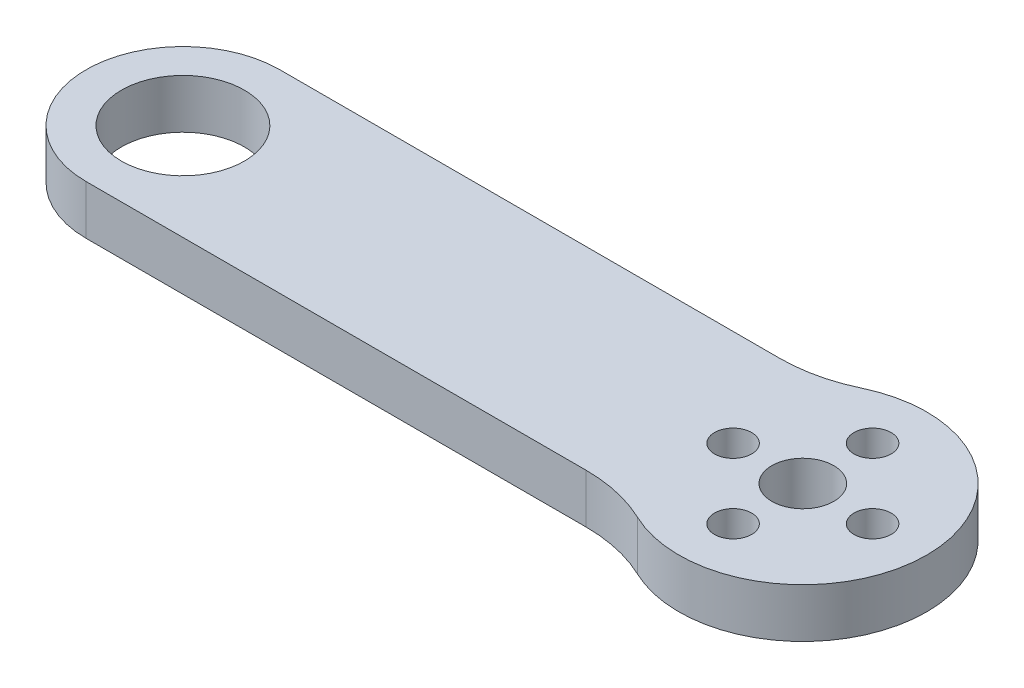
ISO-10303-21;
HEADER;
FILE_DESCRIPTION(('STEP AP214'),'2;1');
FILE_NAME('part.step','',(''),(''),'','','');
FILE_SCHEMA(('AUTOMOTIVE_DESIGN { 1 0 10303 214 1 1 1 1 }'));
ENDSEC;
DATA;
#1=APPLICATION_CONTEXT('core data for automotive mechanical design processes');
#2=APPLICATION_PROTOCOL_DEFINITION('international standard','automotive_design',2000,#1);
#3=PRODUCT_CONTEXT('',#1,'mechanical');
#4=PRODUCT('Part','Part','',(#3));
#5=PRODUCT_RELATED_PRODUCT_CATEGORY('part','',(#4));
#6=PRODUCT_DEFINITION_FORMATION('','',#4);
#7=PRODUCT_DEFINITION_CONTEXT('part definition',#1,'design');
#8=PRODUCT_DEFINITION('design','',#6,#7);
#9=PRODUCT_DEFINITION_SHAPE('','',#8);
#10=(LENGTH_UNIT() NAMED_UNIT(*) SI_UNIT(.MILLI.,.METRE.));
#11=(NAMED_UNIT(*) PLANE_ANGLE_UNIT() SI_UNIT($,.RADIAN.));
#12=(NAMED_UNIT(*) SI_UNIT($,.STERADIAN.) SOLID_ANGLE_UNIT());
#13=UNCERTAINTY_MEASURE_WITH_UNIT(LENGTH_MEASURE(1.E-05),#10,'distance_accuracy_value','');
#14=(GEOMETRIC_REPRESENTATION_CONTEXT(3) GLOBAL_UNCERTAINTY_ASSIGNED_CONTEXT((#13)) GLOBAL_UNIT_ASSIGNED_CONTEXT((#10,
#11,#12)) REPRESENTATION_CONTEXT('',''));
#15=CARTESIAN_POINT('',(0.,0.,0.));
#16=DIRECTION('',(0.,0.,1.));
#17=DIRECTION('',(1.,0.,0.));
#18=AXIS2_PLACEMENT_3D('',#15,#16,#17);
#19=CARTESIAN_POINT('',(-7.74193128360102,3.175,16.25));
#20=DIRECTION('',(0.,-1.,0.));
#21=DIRECTION('',(0.,0.,-1.));
#22=AXIS2_PLACEMENT_3D('',#19,#20,#21);
#23=PLANE('',#22);
#24=CARTESIAN_POINT('',(0.,3.175,-4.5));
#25=DIRECTION('',(0.,1.,0.));
#26=DIRECTION('',(0.,0.,1.));
#27=AXIS2_PLACEMENT_3D('',#24,#25,#26);
#28=CIRCLE('',#27,1.2);
#29=CARTESIAN_POINT('',(0.,3.175,-3.3));
#30=VERTEX_POINT('',#29);
#31=EDGE_CURVE('E192',#30,#30,#28,.T.);
#32=ORIENTED_EDGE('',*,*,#31,.F.);
#33=EDGE_LOOP('',(#32));
#34=FACE_BOUND('',#33,.T.);
#35=CARTESIAN_POINT('',(4.5,3.175,0.));
#36=DIRECTION('',(0.,1.,0.));
#37=DIRECTION('',(0.,0.,1.));
#38=AXIS2_PLACEMENT_3D('',#35,#36,#37);
#39=CIRCLE('',#38,1.2);
#40=CARTESIAN_POINT('',(4.5,3.175,1.2));
#41=VERTEX_POINT('',#40);
#42=EDGE_CURVE('E194',#41,#41,#39,.T.);
#43=ORIENTED_EDGE('',*,*,#42,.F.);
#44=EDGE_LOOP('',(#43));
#45=FACE_BOUND('',#44,.T.);
#46=CARTESIAN_POINT('',(0.,3.175,4.5));
#47=DIRECTION('',(0.,1.,0.));
#48=DIRECTION('',(0.,0.,1.));
#49=AXIS2_PLACEMENT_3D('',#46,#47,#48);
#50=CIRCLE('',#49,1.2);
#51=CARTESIAN_POINT('',(0.,3.175,5.7));
#52=VERTEX_POINT('',#51);
#53=EDGE_CURVE('E202',#52,#52,#50,.T.);
#54=ORIENTED_EDGE('',*,*,#53,.F.);
#55=EDGE_LOOP('',(#54));
#56=FACE_BOUND('',#55,.T.);
#57=CARTESIAN_POINT('',(-4.5,3.175,0.));
#58=DIRECTION('',(0.,1.,0.));
#59=DIRECTION('',(0.,0.,1.));
#60=AXIS2_PLACEMENT_3D('',#57,#58,#59);
#61=CIRCLE('',#60,1.2);
#62=CARTESIAN_POINT('',(-4.5,3.175,1.2));
#63=VERTEX_POINT('',#62);
#64=EDGE_CURVE('E208',#63,#63,#61,.T.);
#65=ORIENTED_EDGE('',*,*,#64,.F.);
#66=EDGE_LOOP('',(#65));
#67=FACE_BOUND('',#66,.T.);
#68=CARTESIAN_POINT('',(-7.74193128360102,3.175,16.25));
#69=DIRECTION('',(0.,-1.,0.));
#70=DIRECTION('',(0.,0.,-1.));
#71=AXIS2_PLACEMENT_3D('',#68,#69,#70);
#72=CIRCLE('',#71,10.);
#73=CARTESIAN_POINT('',(-7.74193128360102,3.175,6.25));
#74=VERTEX_POINT('',#73);
#75=CARTESIAN_POINT('',(-3.44085834826712,3.175,7.22222222222222));
#76=VERTEX_POINT('',#75);
#77=EDGE_CURVE('E130',#74,#76,#72,.T.);
#78=ORIENTED_EDGE('',*,*,#77,.T.);
#79=CARTESIAN_POINT('',(0.,3.175,0.));
#80=DIRECTION('',(0.,1.,0.));
#81=DIRECTION('',(0.,0.,1.));
#82=AXIS2_PLACEMENT_3D('',#79,#80,#81);
#83=CIRCLE('',#82,8.);
#84=CARTESIAN_POINT('',(-3.44085834826712,3.175,-7.22222222222222));
#85=VERTEX_POINT('',#84);
#86=EDGE_CURVE('E88',#76,#85,#83,.T.);
#87=ORIENTED_EDGE('',*,*,#86,.T.);
#88=CARTESIAN_POINT('',(-7.74193128360102,3.175,-16.25));
#89=DIRECTION('',(0.,-1.,0.));
#90=DIRECTION('',(0.,0.,1.));
#91=AXIS2_PLACEMENT_3D('',#88,#89,#90);
#92=CIRCLE('',#91,10.);
#93=CARTESIAN_POINT('',(-7.74193128360102,3.175,-6.25));
#94=VERTEX_POINT('',#93);
#95=EDGE_CURVE('E101',#85,#94,#92,.T.);
#96=ORIENTED_EDGE('',*,*,#95,.T.);
#97=DIRECTION('',(-1.,0.,0.));
#98=VECTOR('',#97,1.);
#99=CARTESIAN_POINT('',(-7.74193128360102,3.175,-6.25));
#100=LINE('',#99,#98);
#101=CARTESIAN_POINT('',(-40.,3.175,-6.24999999999999));
#102=VERTEX_POINT('',#101);
#103=EDGE_CURVE('E95',#94,#102,#100,.T.);
#104=ORIENTED_EDGE('',*,*,#103,.T.);
#105=CARTESIAN_POINT('',(-40.,3.175,0.));
#106=DIRECTION('',(0.,1.,0.));
#107=DIRECTION('',(0.,0.,-1.));
#108=AXIS2_PLACEMENT_3D('',#105,#106,#107);
#109=CIRCLE('',#108,6.25);
#110=CARTESIAN_POINT('',(-40.,3.175,6.25));
#111=VERTEX_POINT('',#110);
#112=EDGE_CURVE('E99',#102,#111,#109,.T.);
#113=ORIENTED_EDGE('',*,*,#112,.T.);
#114=DIRECTION('',(1.,0.,0.));
#115=VECTOR('',#114,1.);
#116=CARTESIAN_POINT('',(-40.,3.175,6.25));
#117=LINE('',#116,#115);
#118=EDGE_CURVE('E51',#111,#74,#117,.T.);
#119=ORIENTED_EDGE('',*,*,#118,.T.);
#120=EDGE_LOOP('',(#78,#87,#96,#104,#113,#119));
#121=FACE_BOUND('',#120,.T.);
#122=CARTESIAN_POINT('',(0.,3.175,0.));
#123=DIRECTION('',(0.,1.,0.));
#124=DIRECTION('',(0.,0.,1.));
#125=AXIS2_PLACEMENT_3D('',#122,#123,#124);
#126=CIRCLE('',#125,2.);
#127=CARTESIAN_POINT('',(0.,3.175,2.));
#128=VERTEX_POINT('',#127);
#129=EDGE_CURVE('E123',#128,#128,#126,.T.);
#130=ORIENTED_EDGE('',*,*,#129,.F.);
#131=EDGE_LOOP('',(#130));
#132=FACE_BOUND('',#131,.T.);
#133=CARTESIAN_POINT('',(-40.,3.175,0.));
#134=DIRECTION('',(0.,1.,0.));
#135=DIRECTION('',(0.,0.,1.));
#136=AXIS2_PLACEMENT_3D('',#133,#134,#135);
#137=CIRCLE('',#136,3.96875);
#138=CARTESIAN_POINT('',(-40.,3.175,3.96875));
#139=VERTEX_POINT('',#138);
#140=EDGE_CURVE('E215',#139,#139,#137,.T.);
#141=ORIENTED_EDGE('',*,*,#140,.F.);
#142=EDGE_LOOP('',(#141));
#143=FACE_BOUND('',#142,.T.);
#144=ADVANCED_FACE('F34',(#34,#45,#56,#67,#121,#132,#143),#23,.F.);
#145=CARTESIAN_POINT('',(-7.74193128360102,0.,16.25));
#146=DIRECTION('',(0.,-1.,0.));
#147=DIRECTION('',(0.,0.,-1.));
#148=AXIS2_PLACEMENT_3D('',#145,#146,#147);
#149=PLANE('',#148);
#150=CARTESIAN_POINT('',(0.,0.,-4.5));
#151=DIRECTION('',(0.,1.,0.));
#152=DIRECTION('',(0.,0.,1.));
#153=AXIS2_PLACEMENT_3D('',#150,#151,#152);
#154=CIRCLE('',#153,1.2);
#155=CARTESIAN_POINT('',(0.,0.,-3.3));
#156=VERTEX_POINT('',#155);
#157=EDGE_CURVE('E190',#156,#156,#154,.T.);
#158=ORIENTED_EDGE('',*,*,#157,.T.);
#159=EDGE_LOOP('',(#158));
#160=FACE_BOUND('',#159,.T.);
#161=CARTESIAN_POINT('',(4.5,0.,0.));
#162=DIRECTION('',(0.,1.,0.));
#163=DIRECTION('',(0.,0.,1.));
#164=AXIS2_PLACEMENT_3D('',#161,#162,#163);
#165=CIRCLE('',#164,1.2);
#166=CARTESIAN_POINT('',(4.5,0.,1.2));
#167=VERTEX_POINT('',#166);
#168=EDGE_CURVE('E199',#167,#167,#165,.T.);
#169=ORIENTED_EDGE('',*,*,#168,.T.);
#170=EDGE_LOOP('',(#169));
#171=FACE_BOUND('',#170,.T.);
#172=CARTESIAN_POINT('',(0.,0.,4.5));
#173=DIRECTION('',(0.,1.,0.));
#174=DIRECTION('',(0.,0.,1.));
#175=AXIS2_PLACEMENT_3D('',#172,#173,#174);
#176=CIRCLE('',#175,1.2);
#177=CARTESIAN_POINT('',(0.,0.,5.7));
#178=VERTEX_POINT('',#177);
#179=EDGE_CURVE('E205',#178,#178,#176,.T.);
#180=ORIENTED_EDGE('',*,*,#179,.T.);
#181=EDGE_LOOP('',(#180));
#182=FACE_BOUND('',#181,.T.);
#183=CARTESIAN_POINT('',(-4.5,0.,0.));
#184=DIRECTION('',(0.,1.,0.));
#185=DIRECTION('',(0.,0.,1.));
#186=AXIS2_PLACEMENT_3D('',#183,#184,#185);
#187=CIRCLE('',#186,1.2);
#188=CARTESIAN_POINT('',(-4.5,0.,1.2));
#189=VERTEX_POINT('',#188);
#190=EDGE_CURVE('E211',#189,#189,#187,.T.);
#191=ORIENTED_EDGE('',*,*,#190,.T.);
#192=EDGE_LOOP('',(#191));
#193=FACE_BOUND('',#192,.T.);
#194=CARTESIAN_POINT('',(0.,0.,0.));
#195=DIRECTION('',(0.,1.,0.));
#196=DIRECTION('',(0.,0.,1.));
#197=AXIS2_PLACEMENT_3D('',#194,#195,#196);
#198=CIRCLE('',#197,2.);
#199=CARTESIAN_POINT('',(0.,0.,2.));
#200=VERTEX_POINT('',#199);
#201=EDGE_CURVE('E218',#200,#200,#198,.T.);
#202=ORIENTED_EDGE('',*,*,#201,.T.);
#203=EDGE_LOOP('',(#202));
#204=FACE_BOUND('',#203,.T.);
#205=CARTESIAN_POINT('',(-7.74193128360102,0.,16.25));
#206=DIRECTION('',(0.,-1.,0.));
#207=DIRECTION('',(0.,0.,-1.));
#208=AXIS2_PLACEMENT_3D('',#205,#206,#207);
#209=CIRCLE('',#208,10.);
#210=CARTESIAN_POINT('',(-7.74193128360102,0.,6.25));
#211=VERTEX_POINT('',#210);
#212=CARTESIAN_POINT('',(-3.44085834826712,0.,7.22222222222222));
#213=VERTEX_POINT('',#212);
#214=EDGE_CURVE('E119',#211,#213,#209,.T.);
#215=ORIENTED_EDGE('',*,*,#214,.F.);
#216=DIRECTION('',(1.,0.,0.));
#217=VECTOR('',#216,1.);
#218=CARTESIAN_POINT('',(-40.,0.,6.25));
#219=LINE('',#218,#217);
#220=CARTESIAN_POINT('',(-40.,0.,6.25));
#221=VERTEX_POINT('',#220);
#222=EDGE_CURVE('E80',#221,#211,#219,.T.);
#223=ORIENTED_EDGE('',*,*,#222,.F.);
#224=CARTESIAN_POINT('',(-40.,0.,0.));
#225=DIRECTION('',(0.,1.,0.));
#226=DIRECTION('',(0.,0.,-1.));
#227=AXIS2_PLACEMENT_3D('',#224,#225,#226);
#228=CIRCLE('',#227,6.25);
#229=CARTESIAN_POINT('',(-40.,0.,-6.24999999999999));
#230=VERTEX_POINT('',#229);
#231=EDGE_CURVE('E74',#230,#221,#228,.T.);
#232=ORIENTED_EDGE('',*,*,#231,.F.);
#233=DIRECTION('',(-1.,0.,0.));
#234=VECTOR('',#233,1.);
#235=CARTESIAN_POINT('',(-7.74193128360102,0.,-6.25));
#236=LINE('',#235,#234);
#237=CARTESIAN_POINT('',(-7.74193128360102,0.,-6.25));
#238=VERTEX_POINT('',#237);
#239=EDGE_CURVE('E109',#238,#230,#236,.T.);
#240=ORIENTED_EDGE('',*,*,#239,.F.);
#241=CARTESIAN_POINT('',(-7.74193128360102,0.,-16.25));
#242=DIRECTION('',(0.,-1.,0.));
#243=DIRECTION('',(0.,0.,1.));
#244=AXIS2_PLACEMENT_3D('',#241,#242,#243);
#245=CIRCLE('',#244,10.);
#246=CARTESIAN_POINT('',(-3.44085834826712,0.,-7.22222222222222));
#247=VERTEX_POINT('',#246);
#248=EDGE_CURVE('E125',#247,#238,#245,.T.);
#249=ORIENTED_EDGE('',*,*,#248,.F.);
#250=CARTESIAN_POINT('',(0.,0.,0.));
#251=DIRECTION('',(0.,1.,0.));
#252=DIRECTION('',(0.,0.,1.));
#253=AXIS2_PLACEMENT_3D('',#250,#251,#252);
#254=CIRCLE('',#253,8.);
#255=EDGE_CURVE('E122',#213,#247,#254,.T.);
#256=ORIENTED_EDGE('',*,*,#255,.F.);
#257=EDGE_LOOP('',(#215,#223,#232,#240,#249,#256));
#258=FACE_BOUND('',#257,.T.);
#259=CARTESIAN_POINT('',(-40.,0.,0.));
#260=DIRECTION('',(0.,1.,0.));
#261=DIRECTION('',(0.,0.,1.));
#262=AXIS2_PLACEMENT_3D('',#259,#260,#261);
#263=CIRCLE('',#262,3.96875);
#264=CARTESIAN_POINT('',(-40.,0.,3.96875));
#265=VERTEX_POINT('',#264);
#266=EDGE_CURVE('E214',#265,#265,#263,.T.);
#267=ORIENTED_EDGE('',*,*,#266,.T.);
#268=EDGE_LOOP('',(#267));
#269=FACE_BOUND('',#268,.T.);
#270=ADVANCED_FACE('F139',(#160,#171,#182,#193,#204,#258,#269),#149,.T.);
#271=CARTESIAN_POINT('',(-7.74193128360102,3.175,16.25));
#272=DIRECTION('',(0.,-1.,0.));
#273=DIRECTION('',(0.,0.,-1.));
#274=AXIS2_PLACEMENT_3D('',#271,#272,#273);
#275=CYLINDRICAL_SURFACE('',#274,10.);
#276=ORIENTED_EDGE('',*,*,#214,.T.);
#277=DIRECTION('',(0.,-1.,0.));
#278=VECTOR('',#277,1.);
#279=CARTESIAN_POINT('',(-3.44085834826712,3.175,7.22222222222222));
#280=LINE('',#279,#278);
#281=EDGE_CURVE('E11',#76,#213,#280,.T.);
#282=ORIENTED_EDGE('',*,*,#281,.F.);
#283=ORIENTED_EDGE('',*,*,#77,.F.);
#284=DIRECTION('',(0.,-1.,0.));
#285=VECTOR('',#284,1.);
#286=CARTESIAN_POINT('',(-7.74193128360102,3.175,6.25));
#287=LINE('',#286,#285);
#288=EDGE_CURVE('E115',#74,#211,#287,.T.);
#289=ORIENTED_EDGE('',*,*,#288,.T.);
#290=EDGE_LOOP('',(#276,#282,#283,#289));
#291=FACE_BOUND('',#290,.T.);
#292=ADVANCED_FACE('F36',(#291),#275,.F.);
#293=CARTESIAN_POINT('',(0.,3.175,0.));
#294=DIRECTION('',(0.,-1.,0.));
#295=DIRECTION('',(0.,0.,-1.));
#296=AXIS2_PLACEMENT_3D('',#293,#294,#295);
#297=CYLINDRICAL_SURFACE('',#296,8.);
#298=ORIENTED_EDGE('',*,*,#255,.T.);
#299=DIRECTION('',(0.,-1.,0.));
#300=VECTOR('',#299,1.);
#301=CARTESIAN_POINT('',(-3.44085834826712,3.175,-7.22222222222222));
#302=LINE('',#301,#300);
#303=EDGE_CURVE('E43',#85,#247,#302,.T.);
#304=ORIENTED_EDGE('',*,*,#303,.F.);
#305=ORIENTED_EDGE('',*,*,#86,.F.);
#306=ORIENTED_EDGE('',*,*,#281,.T.);
#307=EDGE_LOOP('',(#298,#304,#305,#306));
#308=FACE_BOUND('',#307,.T.);
#309=ADVANCED_FACE('F296',(#308),#297,.T.);
#310=CARTESIAN_POINT('',(-7.74193128360102,3.175,-16.25));
#311=DIRECTION('',(0.,-1.,0.));
#312=DIRECTION('',(0.,0.,-1.));
#313=AXIS2_PLACEMENT_3D('',#310,#311,#312);
#314=CYLINDRICAL_SURFACE('',#313,10.);
#315=ORIENTED_EDGE('',*,*,#248,.T.);
#316=DIRECTION('',(0.,-1.,0.));
#317=VECTOR('',#316,1.);
#318=CARTESIAN_POINT('',(-7.74193128360102,3.175,-6.25));
#319=LINE('',#318,#317);
#320=EDGE_CURVE('E110',#94,#238,#319,.T.);
#321=ORIENTED_EDGE('',*,*,#320,.F.);
#322=ORIENTED_EDGE('',*,*,#95,.F.);
#323=ORIENTED_EDGE('',*,*,#303,.T.);
#324=EDGE_LOOP('',(#315,#321,#322,#323));
#325=FACE_BOUND('',#324,.T.);
#326=ADVANCED_FACE('F136',(#325),#314,.F.);
#327=CARTESIAN_POINT('',(-7.74193128360102,3.175,-6.25));
#328=DIRECTION('',(0.,0.,1.));
#329=DIRECTION('',(1.,0.,0.));
#330=AXIS2_PLACEMENT_3D('',#327,#328,#329);
#331=PLANE('',#330);
#332=ORIENTED_EDGE('',*,*,#239,.T.);
#333=DIRECTION('',(0.,-1.,0.));
#334=VECTOR('',#333,1.);
#335=CARTESIAN_POINT('',(-40.,3.175,-6.24999999999999));
#336=LINE('',#335,#334);
#337=EDGE_CURVE('E106',#102,#230,#336,.T.);
#338=ORIENTED_EDGE('',*,*,#337,.F.);
#339=ORIENTED_EDGE('',*,*,#103,.F.);
#340=ORIENTED_EDGE('',*,*,#320,.T.);
#341=EDGE_LOOP('',(#332,#338,#339,#340));
#342=FACE_BOUND('',#341,.T.);
#343=ADVANCED_FACE('F107',(#342),#331,.F.);
#344=CARTESIAN_POINT('',(-40.,3.175,0.));
#345=DIRECTION('',(0.,-1.,0.));
#346=DIRECTION('',(0.,0.,-1.));
#347=AXIS2_PLACEMENT_3D('',#344,#345,#346);
#348=CYLINDRICAL_SURFACE('',#347,6.25);
#349=ORIENTED_EDGE('',*,*,#231,.T.);
#350=DIRECTION('',(0.,-1.,0.));
#351=VECTOR('',#350,1.);
#352=CARTESIAN_POINT('',(-40.,3.175,6.25));
#353=LINE('',#352,#351);
#354=EDGE_CURVE('E111',#111,#221,#353,.T.);
#355=ORIENTED_EDGE('',*,*,#354,.F.);
#356=ORIENTED_EDGE('',*,*,#112,.F.);
#357=ORIENTED_EDGE('',*,*,#337,.T.);
#358=EDGE_LOOP('',(#349,#355,#356,#357));
#359=FACE_BOUND('',#358,.T.);
#360=ADVANCED_FACE('F113',(#359),#348,.T.);
#361=CARTESIAN_POINT('',(-40.,3.175,6.25));
#362=DIRECTION('',(0.,0.,-1.));
#363=DIRECTION('',(-1.,0.,0.));
#364=AXIS2_PLACEMENT_3D('',#361,#362,#363);
#365=PLANE('',#364);
#366=ORIENTED_EDGE('',*,*,#222,.T.);
#367=ORIENTED_EDGE('',*,*,#288,.F.);
#368=ORIENTED_EDGE('',*,*,#118,.F.);
#369=ORIENTED_EDGE('',*,*,#354,.T.);
#370=EDGE_LOOP('',(#366,#367,#368,#369));
#371=FACE_BOUND('',#370,.T.);
#372=ADVANCED_FACE('F144',(#371),#365,.F.);
#373=CARTESIAN_POINT('',(0.,3.175,0.));
#374=DIRECTION('',(0.,-1.,0.));
#375=DIRECTION('',(0.,0.,-1.));
#376=AXIS2_PLACEMENT_3D('',#373,#374,#375);
#377=CYLINDRICAL_SURFACE('',#376,2.);
#378=ORIENTED_EDGE('',*,*,#129,.T.);
#379=EDGE_LOOP('',(#378));
#380=FACE_BOUND('',#379,.T.);
#381=ORIENTED_EDGE('',*,*,#201,.F.);
#382=EDGE_LOOP('',(#381));
#383=FACE_BOUND('',#382,.T.);
#384=ADVANCED_FACE('F146',(#380,#383),#377,.F.);
#385=CARTESIAN_POINT('',(-40.,3.175,0.));
#386=DIRECTION('',(0.,-1.,0.));
#387=DIRECTION('',(0.,0.,-1.));
#388=AXIS2_PLACEMENT_3D('',#385,#386,#387);
#389=CYLINDRICAL_SURFACE('',#388,3.96875);
#390=ORIENTED_EDGE('',*,*,#140,.T.);
#391=EDGE_LOOP('',(#390));
#392=FACE_BOUND('',#391,.T.);
#393=ORIENTED_EDGE('',*,*,#266,.F.);
#394=EDGE_LOOP('',(#393));
#395=FACE_BOUND('',#394,.T.);
#396=ADVANCED_FACE('F152',(#392,#395),#389,.F.);
#397=CARTESIAN_POINT('',(-4.5,3.175,0.));
#398=DIRECTION('',(0.,1.,0.));
#399=DIRECTION('',(0.,0.,1.));
#400=AXIS2_PLACEMENT_3D('',#397,#398,#399);
#401=CYLINDRICAL_SURFACE('',#400,1.2);
#402=ORIENTED_EDGE('',*,*,#190,.F.);
#403=EDGE_LOOP('',(#402));
#404=FACE_BOUND('',#403,.T.);
#405=ORIENTED_EDGE('',*,*,#64,.T.);
#406=EDGE_LOOP('',(#405));
#407=FACE_BOUND('',#406,.T.);
#408=ADVANCED_FACE('F169',(#404,#407),#401,.F.);
#409=CARTESIAN_POINT('',(0.,3.175,4.5));
#410=DIRECTION('',(0.,1.,0.));
#411=DIRECTION('',(0.,0.,1.));
#412=AXIS2_PLACEMENT_3D('',#409,#410,#411);
#413=CYLINDRICAL_SURFACE('',#412,1.2);
#414=ORIENTED_EDGE('',*,*,#179,.F.);
#415=EDGE_LOOP('',(#414));
#416=FACE_BOUND('',#415,.T.);
#417=ORIENTED_EDGE('',*,*,#53,.T.);
#418=EDGE_LOOP('',(#417));
#419=FACE_BOUND('',#418,.T.);
#420=ADVANCED_FACE('F173',(#416,#419),#413,.F.);
#421=CARTESIAN_POINT('',(4.5,3.175,0.));
#422=DIRECTION('',(0.,1.,0.));
#423=DIRECTION('',(0.,0.,1.));
#424=AXIS2_PLACEMENT_3D('',#421,#422,#423);
#425=CYLINDRICAL_SURFACE('',#424,1.2);
#426=ORIENTED_EDGE('',*,*,#168,.F.);
#427=EDGE_LOOP('',(#426));
#428=FACE_BOUND('',#427,.T.);
#429=ORIENTED_EDGE('',*,*,#42,.T.);
#430=EDGE_LOOP('',(#429));
#431=FACE_BOUND('',#430,.T.);
#432=ADVANCED_FACE('F177',(#428,#431),#425,.F.);
#433=CARTESIAN_POINT('',(0.,3.175,-4.5));
#434=DIRECTION('',(0.,1.,0.));
#435=DIRECTION('',(0.,0.,1.));
#436=AXIS2_PLACEMENT_3D('',#433,#434,#435);
#437=CYLINDRICAL_SURFACE('',#436,1.2);
#438=ORIENTED_EDGE('',*,*,#157,.F.);
#439=EDGE_LOOP('',(#438));
#440=FACE_BOUND('',#439,.T.);
#441=ORIENTED_EDGE('',*,*,#31,.T.);
#442=EDGE_LOOP('',(#441));
#443=FACE_BOUND('',#442,.T.);
#444=ADVANCED_FACE('F181',(#440,#443),#437,.F.);
#445=CLOSED_SHELL('',(#144,#270,#292,#309,#326,#343,#360,#372,#384,#396,#408,#420,#432,#444));
#446=MANIFOLD_SOLID_BREP('B2',#445);
#447=ADVANCED_BREP_SHAPE_REPRESENTATION('',(#18,#446),#14);
#448=SHAPE_DEFINITION_REPRESENTATION(#9,#447);
ENDSEC;
END-ISO-10303-21;
